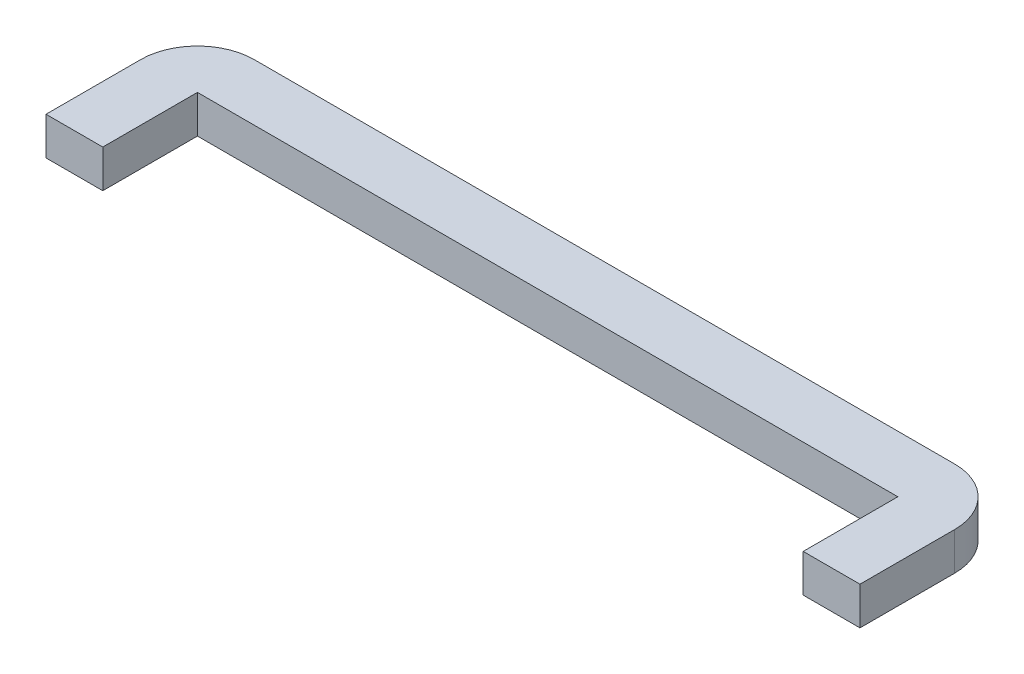
ISO-10303-21;
HEADER;
FILE_DESCRIPTION(('STEP AP214'),'2;1');
FILE_NAME('part.step','',(''),(''),'','','');
FILE_SCHEMA(('AUTOMOTIVE_DESIGN { 1 0 10303 214 1 1 1 1 }'));
ENDSEC;
DATA;
#1=APPLICATION_CONTEXT('core data for automotive mechanical design processes');
#2=APPLICATION_PROTOCOL_DEFINITION('international standard','automotive_design',2000,#1);
#3=PRODUCT_CONTEXT('',#1,'mechanical');
#4=PRODUCT('Part','Part','',(#3));
#5=PRODUCT_RELATED_PRODUCT_CATEGORY('part','',(#4));
#6=PRODUCT_DEFINITION_FORMATION('','',#4);
#7=PRODUCT_DEFINITION_CONTEXT('part definition',#1,'design');
#8=PRODUCT_DEFINITION('design','',#6,#7);
#9=PRODUCT_DEFINITION_SHAPE('','',#8);
#10=(LENGTH_UNIT() NAMED_UNIT(*) SI_UNIT(.MILLI.,.METRE.));
#11=(NAMED_UNIT(*) PLANE_ANGLE_UNIT() SI_UNIT($,.RADIAN.));
#12=(NAMED_UNIT(*) SI_UNIT($,.STERADIAN.) SOLID_ANGLE_UNIT());
#13=UNCERTAINTY_MEASURE_WITH_UNIT(LENGTH_MEASURE(1.E-05),#10,'distance_accuracy_value','');
#14=(GEOMETRIC_REPRESENTATION_CONTEXT(3) GLOBAL_UNCERTAINTY_ASSIGNED_CONTEXT((#13)) GLOBAL_UNIT_ASSIGNED_CONTEXT((#10,
#11,#12)) REPRESENTATION_CONTEXT('',''));
#15=CARTESIAN_POINT('',(0.,0.,0.));
#16=DIRECTION('',(0.,0.,1.));
#17=DIRECTION('',(1.,0.,0.));
#18=AXIS2_PLACEMENT_3D('',#15,#16,#17);
#19=CARTESIAN_POINT('',(0.,1.,1.5));
#20=DIRECTION('',(0.,0.,-1.));
#21=DIRECTION('',(-1.,0.,0.));
#22=AXIS2_PLACEMENT_3D('',#19,#20,#21);
#23=PLANE('',#22);
#24=DIRECTION('',(1.,0.,0.));
#25=VECTOR('',#24,1.);
#26=CARTESIAN_POINT('',(0.,-1.,1.5));
#27=LINE('',#26,#25);
#28=CARTESIAN_POINT('',(-18.5,-1.,1.5));
#29=VERTEX_POINT('',#28);
#30=CARTESIAN_POINT('',(18.5,-1.,1.5));
#31=VERTEX_POINT('',#30);
#32=EDGE_CURVE('E139',#29,#31,#27,.T.);
#33=ORIENTED_EDGE('',*,*,#32,.T.);
#34=DIRECTION('',(0.,-1.,0.));
#35=VECTOR('',#34,1.);
#36=CARTESIAN_POINT('',(18.5,1.,1.5));
#37=LINE('',#36,#35);
#38=CARTESIAN_POINT('',(18.5,1.,1.5));
#39=VERTEX_POINT('',#38);
#40=EDGE_CURVE('E122',#39,#31,#37,.T.);
#41=ORIENTED_EDGE('',*,*,#40,.F.);
#42=DIRECTION('',(1.,0.,0.));
#43=VECTOR('',#42,1.);
#44=CARTESIAN_POINT('',(0.,1.,1.5));
#45=LINE('',#44,#43);
#46=CARTESIAN_POINT('',(-18.5,1.,1.5));
#47=VERTEX_POINT('',#46);
#48=EDGE_CURVE('E128',#47,#39,#45,.T.);
#49=ORIENTED_EDGE('',*,*,#48,.F.);
#50=DIRECTION('',(0.,-1.,0.));
#51=VECTOR('',#50,1.);
#52=CARTESIAN_POINT('',(-18.5,1.,1.5));
#53=LINE('',#52,#51);
#54=EDGE_CURVE('E196',#47,#29,#53,.T.);
#55=ORIENTED_EDGE('',*,*,#54,.T.);
#56=EDGE_LOOP('',(#33,#41,#49,#55));
#57=FACE_BOUND('',#56,.T.);
#58=ADVANCED_FACE('F39',(#57),#23,.F.);
#59=CARTESIAN_POINT('',(18.5,1.,0.));
#60=DIRECTION('',(1.,0.,0.));
#61=DIRECTION('',(0.,0.,-1.));
#62=AXIS2_PLACEMENT_3D('',#59,#60,#61);
#63=PLANE('',#62);
#64=DIRECTION('',(0.,0.,1.));
#65=VECTOR('',#64,1.);
#66=CARTESIAN_POINT('',(18.5,-1.,0.));
#67=LINE('',#66,#65);
#68=CARTESIAN_POINT('',(18.5,-1.,6.5));
#69=VERTEX_POINT('',#68);
#70=EDGE_CURVE('E207',#31,#69,#67,.T.);
#71=ORIENTED_EDGE('',*,*,#70,.T.);
#72=DIRECTION('',(0.,-1.,0.));
#73=VECTOR('',#72,1.);
#74=CARTESIAN_POINT('',(18.5,1.,6.5));
#75=LINE('',#74,#73);
#76=CARTESIAN_POINT('',(18.5,1.,6.5));
#77=VERTEX_POINT('',#76);
#78=EDGE_CURVE('E124',#77,#69,#75,.T.);
#79=ORIENTED_EDGE('',*,*,#78,.F.);
#80=DIRECTION('',(0.,0.,1.));
#81=VECTOR('',#80,1.);
#82=CARTESIAN_POINT('',(18.5,1.,0.));
#83=LINE('',#82,#81);
#84=EDGE_CURVE('E117',#39,#77,#83,.T.);
#85=ORIENTED_EDGE('',*,*,#84,.F.);
#86=ORIENTED_EDGE('',*,*,#40,.T.);
#87=EDGE_LOOP('',(#71,#79,#85,#86));
#88=FACE_BOUND('',#87,.T.);
#89=ADVANCED_FACE('F120',(#88),#63,.F.);
#90=CARTESIAN_POINT('',(0.,1.,6.50000000000001));
#91=DIRECTION('',(0.,0.,1.));
#92=DIRECTION('',(1.,0.,0.));
#93=AXIS2_PLACEMENT_3D('',#90,#91,#92);
#94=PLANE('',#93);
#95=DIRECTION('',(-1.,0.,0.));
#96=VECTOR('',#95,1.);
#97=CARTESIAN_POINT('',(0.,-1.,6.50000000000001));
#98=LINE('',#97,#96);
#99=CARTESIAN_POINT('',(21.5,-1.,6.5));
#100=VERTEX_POINT('',#99);
#101=EDGE_CURVE('E188',#100,#69,#98,.T.);
#102=ORIENTED_EDGE('',*,*,#101,.F.);
#103=DIRECTION('',(0.,-1.,0.));
#104=VECTOR('',#103,1.);
#105=CARTESIAN_POINT('',(21.5,1.,6.5));
#106=LINE('',#105,#104);
#107=CARTESIAN_POINT('',(21.5,1.,6.5));
#108=VERTEX_POINT('',#107);
#109=EDGE_CURVE('E145',#108,#100,#106,.T.);
#110=ORIENTED_EDGE('',*,*,#109,.F.);
#111=DIRECTION('',(-1.,0.,0.));
#112=VECTOR('',#111,1.);
#113=CARTESIAN_POINT('',(0.,1.,6.50000000000001));
#114=LINE('',#113,#112);
#115=EDGE_CURVE('E127',#108,#77,#114,.T.);
#116=ORIENTED_EDGE('',*,*,#115,.T.);
#117=ORIENTED_EDGE('',*,*,#78,.T.);
#118=EDGE_LOOP('',(#102,#110,#116,#117));
#119=FACE_BOUND('',#118,.T.);
#120=ADVANCED_FACE('F206',(#119),#94,.T.);
#121=CARTESIAN_POINT('',(21.5,1.,0.));
#122=DIRECTION('',(-1.,0.,0.));
#123=DIRECTION('',(0.,0.,1.));
#124=AXIS2_PLACEMENT_3D('',#121,#122,#123);
#125=PLANE('',#124);
#126=DIRECTION('',(0.,0.,-1.));
#127=VECTOR('',#126,1.);
#128=CARTESIAN_POINT('',(21.5,-1.,0.));
#129=LINE('',#128,#127);
#130=CARTESIAN_POINT('',(21.5,-1.,1.5));
#131=VERTEX_POINT('',#130);
#132=EDGE_CURVE('E184',#100,#131,#129,.T.);
#133=ORIENTED_EDGE('',*,*,#132,.T.);
#134=DIRECTION('',(0.,-1.,0.));
#135=VECTOR('',#134,1.);
#136=CARTESIAN_POINT('',(21.5,1.,1.5));
#137=LINE('',#136,#135);
#138=CARTESIAN_POINT('',(21.5,1.,1.5));
#139=VERTEX_POINT('',#138);
#140=EDGE_CURVE('E11',#131,#139,#137,.F.);
#141=ORIENTED_EDGE('',*,*,#140,.T.);
#142=DIRECTION('',(0.,0.,-1.));
#143=VECTOR('',#142,1.);
#144=CARTESIAN_POINT('',(21.5,1.,0.));
#145=LINE('',#144,#143);
#146=EDGE_CURVE('E202',#108,#139,#145,.T.);
#147=ORIENTED_EDGE('',*,*,#146,.F.);
#148=ORIENTED_EDGE('',*,*,#109,.T.);
#149=EDGE_LOOP('',(#133,#141,#147,#148));
#150=FACE_BOUND('',#149,.T.);
#151=ADVANCED_FACE('F201',(#150),#125,.F.);
#152=CARTESIAN_POINT('',(0.,1.,-1.5));
#153=DIRECTION('',(0.,0.,-1.));
#154=DIRECTION('',(-1.,0.,0.));
#155=AXIS2_PLACEMENT_3D('',#152,#153,#154);
#156=PLANE('',#155);
#157=DIRECTION('',(1.,0.,0.));
#158=VECTOR('',#157,1.);
#159=CARTESIAN_POINT('',(0.,-1.,-1.5));
#160=LINE('',#159,#158);
#161=CARTESIAN_POINT('',(-18.5,-1.,-1.5));
#162=VERTEX_POINT('',#161);
#163=CARTESIAN_POINT('',(18.5,-1.,-1.5));
#164=VERTEX_POINT('',#163);
#165=EDGE_CURVE('E178',#162,#164,#160,.T.);
#166=ORIENTED_EDGE('',*,*,#165,.F.);
#167=DIRECTION('',(0.,-1.,0.));
#168=VECTOR('',#167,1.);
#169=CARTESIAN_POINT('',(-18.5,1.,-1.5));
#170=LINE('',#169,#168);
#171=CARTESIAN_POINT('',(-18.5,1.,-1.5));
#172=VERTEX_POINT('',#171);
#173=EDGE_CURVE('E155',#162,#172,#170,.F.);
#174=ORIENTED_EDGE('',*,*,#173,.T.);
#175=DIRECTION('',(1.,0.,0.));
#176=VECTOR('',#175,1.);
#177=CARTESIAN_POINT('',(0.,1.,-1.5));
#178=LINE('',#177,#176);
#179=CARTESIAN_POINT('',(18.5,1.,-1.5));
#180=VERTEX_POINT('',#179);
#181=EDGE_CURVE('E161',#172,#180,#178,.T.);
#182=ORIENTED_EDGE('',*,*,#181,.T.);
#183=DIRECTION('',(0.,-1.,0.));
#184=VECTOR('',#183,1.);
#185=CARTESIAN_POINT('',(18.5,-1.,-1.5));
#186=LINE('',#185,#184);
#187=EDGE_CURVE('E152',#180,#164,#186,.T.);
#188=ORIENTED_EDGE('',*,*,#187,.T.);
#189=EDGE_LOOP('',(#166,#174,#182,#188));
#190=FACE_BOUND('',#189,.T.);
#191=ADVANCED_FACE('F182',(#190),#156,.T.);
#192=CARTESIAN_POINT('',(-21.5,1.,0.));
#193=DIRECTION('',(-1.,0.,0.));
#194=DIRECTION('',(0.,0.,1.));
#195=AXIS2_PLACEMENT_3D('',#192,#193,#194);
#196=PLANE('',#195);
#197=DIRECTION('',(0.,0.,-1.));
#198=VECTOR('',#197,1.);
#199=CARTESIAN_POINT('',(-21.5,1.,0.));
#200=LINE('',#199,#198);
#201=CARTESIAN_POINT('',(-21.5,1.,6.5));
#202=VERTEX_POINT('',#201);
#203=CARTESIAN_POINT('',(-21.5,1.,1.5));
#204=VERTEX_POINT('',#203);
#205=EDGE_CURVE('E160',#202,#204,#200,.T.);
#206=ORIENTED_EDGE('',*,*,#205,.T.);
#207=DIRECTION('',(0.,-1.,0.));
#208=VECTOR('',#207,1.);
#209=CARTESIAN_POINT('',(-21.5,1.,1.5));
#210=LINE('',#209,#208);
#211=CARTESIAN_POINT('',(-21.5,-1.,1.5));
#212=VERTEX_POINT('',#211);
#213=EDGE_CURVE('E140',#204,#212,#210,.T.);
#214=ORIENTED_EDGE('',*,*,#213,.T.);
#215=DIRECTION('',(0.,0.,-1.));
#216=VECTOR('',#215,1.);
#217=CARTESIAN_POINT('',(-21.5,-1.,0.));
#218=LINE('',#217,#216);
#219=CARTESIAN_POINT('',(-21.5,-1.,6.5));
#220=VERTEX_POINT('',#219);
#221=EDGE_CURVE('E180',#220,#212,#218,.T.);
#222=ORIENTED_EDGE('',*,*,#221,.F.);
#223=DIRECTION('',(0.,-1.,0.));
#224=VECTOR('',#223,1.);
#225=CARTESIAN_POINT('',(-21.5,1.,6.5));
#226=LINE('',#225,#224);
#227=EDGE_CURVE('E169',#202,#220,#226,.T.);
#228=ORIENTED_EDGE('',*,*,#227,.F.);
#229=EDGE_LOOP('',(#206,#214,#222,#228));
#230=FACE_BOUND('',#229,.T.);
#231=ADVANCED_FACE('F166',(#230),#196,.T.);
#232=CARTESIAN_POINT('',(0.,1.,6.5));
#233=DIRECTION('',(0.,0.,-1.));
#234=DIRECTION('',(-1.,0.,0.));
#235=AXIS2_PLACEMENT_3D('',#232,#233,#234);
#236=PLANE('',#235);
#237=DIRECTION('',(1.,0.,0.));
#238=VECTOR('',#237,1.);
#239=CARTESIAN_POINT('',(0.,-1.,6.5));
#240=LINE('',#239,#238);
#241=CARTESIAN_POINT('',(-18.5,-1.,6.5));
#242=VERTEX_POINT('',#241);
#243=EDGE_CURVE('E186',#220,#242,#240,.T.);
#244=ORIENTED_EDGE('',*,*,#243,.T.);
#245=DIRECTION('',(0.,-1.,0.));
#246=VECTOR('',#245,1.);
#247=CARTESIAN_POINT('',(-18.5,1.,6.5));
#248=LINE('',#247,#246);
#249=CARTESIAN_POINT('',(-18.5,1.,6.5));
#250=VERTEX_POINT('',#249);
#251=EDGE_CURVE('E198',#250,#242,#248,.T.);
#252=ORIENTED_EDGE('',*,*,#251,.F.);
#253=DIRECTION('',(1.,0.,0.));
#254=VECTOR('',#253,1.);
#255=CARTESIAN_POINT('',(0.,1.,6.5));
#256=LINE('',#255,#254);
#257=EDGE_CURVE('E171',#202,#250,#256,.T.);
#258=ORIENTED_EDGE('',*,*,#257,.F.);
#259=ORIENTED_EDGE('',*,*,#227,.T.);
#260=EDGE_LOOP('',(#244,#252,#258,#259));
#261=FACE_BOUND('',#260,.T.);
#262=ADVANCED_FACE('F235',(#261),#236,.F.);
#263=CARTESIAN_POINT('',(-18.5,1.,0.));
#264=DIRECTION('',(1.,0.,0.));
#265=DIRECTION('',(0.,0.,-1.));
#266=AXIS2_PLACEMENT_3D('',#263,#264,#265);
#267=PLANE('',#266);
#268=DIRECTION('',(0.,0.,1.));
#269=VECTOR('',#268,1.);
#270=CARTESIAN_POINT('',(-18.5,-1.,0.));
#271=LINE('',#270,#269);
#272=EDGE_CURVE('E136',#29,#242,#271,.T.);
#273=ORIENTED_EDGE('',*,*,#272,.F.);
#274=ORIENTED_EDGE('',*,*,#54,.F.);
#275=DIRECTION('',(0.,0.,1.));
#276=VECTOR('',#275,1.);
#277=CARTESIAN_POINT('',(-18.5,1.,0.));
#278=LINE('',#277,#276);
#279=EDGE_CURVE('E134',#47,#250,#278,.T.);
#280=ORIENTED_EDGE('',*,*,#279,.T.);
#281=ORIENTED_EDGE('',*,*,#251,.T.);
#282=EDGE_LOOP('',(#273,#274,#280,#281));
#283=FACE_BOUND('',#282,.T.);
#284=ADVANCED_FACE('F238',(#283),#267,.T.);
#285=CARTESIAN_POINT('',(0.,1.,0.));
#286=DIRECTION('',(0.,1.,0.));
#287=DIRECTION('',(0.,0.,1.));
#288=AXIS2_PLACEMENT_3D('',#285,#286,#287);
#289=PLANE('',#288);
#290=ORIENTED_EDGE('',*,*,#181,.F.);
#291=CARTESIAN_POINT('',(-18.5,1.,1.5));
#292=DIRECTION('',(0.,1.,0.));
#293=DIRECTION('',(0.,0.,1.));
#294=AXIS2_PLACEMENT_3D('',#291,#292,#293);
#295=CIRCLE('',#294,3.);
#296=EDGE_CURVE('E47',#172,#204,#295,.T.);
#297=ORIENTED_EDGE('',*,*,#296,.T.);
#298=ORIENTED_EDGE('',*,*,#205,.F.);
#299=ORIENTED_EDGE('',*,*,#257,.T.);
#300=ORIENTED_EDGE('',*,*,#279,.F.);
#301=ORIENTED_EDGE('',*,*,#48,.T.);
#302=ORIENTED_EDGE('',*,*,#84,.T.);
#303=ORIENTED_EDGE('',*,*,#115,.F.);
#304=ORIENTED_EDGE('',*,*,#146,.T.);
#305=CARTESIAN_POINT('',(18.5,1.,1.5));
#306=DIRECTION('',(0.,1.,0.));
#307=DIRECTION('',(0.,0.,1.));
#308=AXIS2_PLACEMENT_3D('',#305,#306,#307);
#309=CIRCLE('',#308,3.);
#310=EDGE_CURVE('E59',#139,#180,#309,.T.);
#311=ORIENTED_EDGE('',*,*,#310,.T.);
#312=EDGE_LOOP('',(#290,#297,#298,#299,#300,#301,#302,#303,#304,#311));
#313=FACE_BOUND('',#312,.T.);
#314=ADVANCED_FACE('F132',(#313),#289,.T.);
#315=CARTESIAN_POINT('',(0.,-1.,0.));
#316=DIRECTION('',(0.,1.,0.));
#317=DIRECTION('',(0.,0.,1.));
#318=AXIS2_PLACEMENT_3D('',#315,#316,#317);
#319=PLANE('',#318);
#320=ORIENTED_EDGE('',*,*,#221,.T.);
#321=CARTESIAN_POINT('',(-18.5,-1.,1.5));
#322=DIRECTION('',(0.,1.,0.));
#323=DIRECTION('',(0.,0.,1.));
#324=AXIS2_PLACEMENT_3D('',#321,#322,#323);
#325=CIRCLE('',#324,3.);
#326=EDGE_CURVE('E150',#212,#162,#325,.F.);
#327=ORIENTED_EDGE('',*,*,#326,.T.);
#328=ORIENTED_EDGE('',*,*,#165,.T.);
#329=CARTESIAN_POINT('',(18.5,-1.,1.5));
#330=DIRECTION('',(0.,1.,0.));
#331=DIRECTION('',(0.,0.,1.));
#332=AXIS2_PLACEMENT_3D('',#329,#330,#331);
#333=CIRCLE('',#332,3.);
#334=EDGE_CURVE('E143',#164,#131,#333,.F.);
#335=ORIENTED_EDGE('',*,*,#334,.T.);
#336=ORIENTED_EDGE('',*,*,#132,.F.);
#337=ORIENTED_EDGE('',*,*,#101,.T.);
#338=ORIENTED_EDGE('',*,*,#70,.F.);
#339=ORIENTED_EDGE('',*,*,#32,.F.);
#340=ORIENTED_EDGE('',*,*,#272,.T.);
#341=ORIENTED_EDGE('',*,*,#243,.F.);
#342=EDGE_LOOP('',(#320,#327,#328,#335,#336,#337,#338,#339,#340,#341));
#343=FACE_BOUND('',#342,.T.);
#344=ADVANCED_FACE('F177',(#343),#319,.F.);
#345=CARTESIAN_POINT('',(-18.5,1.,1.5));
#346=DIRECTION('',(0.,-1.,0.));
#347=DIRECTION('',(0.,0.,-1.));
#348=AXIS2_PLACEMENT_3D('',#345,#346,#347);
#349=CYLINDRICAL_SURFACE('',#348,3.);
#350=ORIENTED_EDGE('',*,*,#296,.F.);
#351=ORIENTED_EDGE('',*,*,#173,.F.);
#352=ORIENTED_EDGE('',*,*,#326,.F.);
#353=ORIENTED_EDGE('',*,*,#213,.F.);
#354=EDGE_LOOP('',(#350,#351,#352,#353));
#355=FACE_BOUND('',#354,.T.);
#356=ADVANCED_FACE('F173',(#355),#349,.T.);
#357=CARTESIAN_POINT('',(18.5,1.,1.5));
#358=DIRECTION('',(0.,1.,0.));
#359=DIRECTION('',(0.,0.,1.));
#360=AXIS2_PLACEMENT_3D('',#357,#358,#359);
#361=CYLINDRICAL_SURFACE('',#360,3.);
#362=ORIENTED_EDGE('',*,*,#310,.F.);
#363=ORIENTED_EDGE('',*,*,#140,.F.);
#364=ORIENTED_EDGE('',*,*,#334,.F.);
#365=ORIENTED_EDGE('',*,*,#187,.F.);
#366=EDGE_LOOP('',(#362,#363,#364,#365));
#367=FACE_BOUND('',#366,.T.);
#368=ADVANCED_FACE('F41',(#367),#361,.T.);
#369=CLOSED_SHELL('',(#58,#89,#120,#151,#191,#231,#262,#284,#314,#344,#356,#368));
#370=MANIFOLD_SOLID_BREP('B2',#369);
#371=ADVANCED_BREP_SHAPE_REPRESENTATION('',(#18,#370),#14);
#372=SHAPE_DEFINITION_REPRESENTATION(#9,#371);
ENDSEC;
END-ISO-10303-21;
